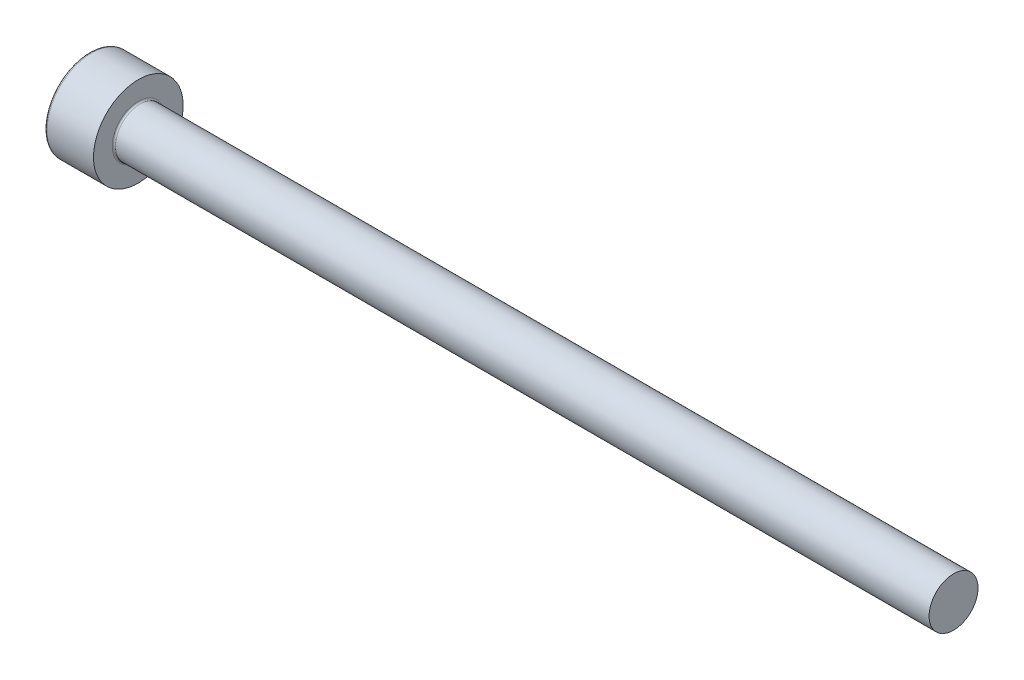
ISO-10303-21;
HEADER;
FILE_DESCRIPTION(('STEP AP214'),'2;1');
FILE_NAME('part.step','',(''),(''),'','','');
FILE_SCHEMA(('AUTOMOTIVE_DESIGN { 1 0 10303 214 1 1 1 1 }'));
ENDSEC;
DATA;
#1=APPLICATION_CONTEXT('core data for automotive mechanical design processes');
#2=APPLICATION_PROTOCOL_DEFINITION('international standard','automotive_design',2000,#1);
#3=PRODUCT_CONTEXT('',#1,'mechanical');
#4=PRODUCT('Part','Part','',(#3));
#5=PRODUCT_RELATED_PRODUCT_CATEGORY('part','',(#4));
#6=PRODUCT_DEFINITION_FORMATION('','',#4);
#7=PRODUCT_DEFINITION_CONTEXT('part definition',#1,'design');
#8=PRODUCT_DEFINITION('design','',#6,#7);
#9=PRODUCT_DEFINITION_SHAPE('','',#8);
#10=(LENGTH_UNIT() NAMED_UNIT(*) SI_UNIT(.MILLI.,.METRE.));
#11=(NAMED_UNIT(*) PLANE_ANGLE_UNIT() SI_UNIT($,.RADIAN.));
#12=(NAMED_UNIT(*) SI_UNIT($,.STERADIAN.) SOLID_ANGLE_UNIT());
#13=UNCERTAINTY_MEASURE_WITH_UNIT(LENGTH_MEASURE(1.E-05),#10,'distance_accuracy_value','');
#14=(GEOMETRIC_REPRESENTATION_CONTEXT(3) GLOBAL_UNCERTAINTY_ASSIGNED_CONTEXT((#13)) GLOBAL_UNIT_ASSIGNED_CONTEXT((#10,
#11,#12)) REPRESENTATION_CONTEXT('',''));
#15=CARTESIAN_POINT('',(0.,0.,0.));
#16=DIRECTION('',(0.,0.,1.));
#17=DIRECTION('',(1.,0.,0.));
#18=AXIS2_PLACEMENT_3D('',#15,#16,#17);
#19=CARTESIAN_POINT('',(-64.4045928047759,8.79516449896665,-40.4453986422559));
#20=DIRECTION('',(-1.,0.,0.));
#21=DIRECTION('',(0.,0.,1.));
#22=AXIS2_PLACEMENT_3D('',#19,#20,#21);
#23=CYLINDRICAL_SURFACE('',#22,1.49999999999999);
#24=CARTESIAN_POINT('',(-29.5545928047759,8.79516449896665,-40.4453986422559));
#25=DIRECTION('',(1.,0.,0.));
#26=DIRECTION('',(0.,0.,-1.));
#27=AXIS2_PLACEMENT_3D('',#24,#25,#26);
#28=CIRCLE('',#27,1.49999999999999);
#29=CARTESIAN_POINT('',(-29.5545928047759,8.79516449896665,-41.9453986422559));
#30=VERTEX_POINT('',#29);
#31=EDGE_CURVE('E156',#30,#30,#28,.T.);
#32=ORIENTED_EDGE('',*,*,#31,.T.);
#33=EDGE_LOOP('',(#32));
#34=FACE_BOUND('',#33,.T.);
#35=CARTESIAN_POINT('',(20.3454071952241,8.79516449896665,-40.4453986422559));
#36=DIRECTION('',(1.,0.,0.));
#37=DIRECTION('',(0.,0.,-1.));
#38=AXIS2_PLACEMENT_3D('',#35,#36,#37);
#39=CIRCLE('',#38,1.49999999999999);
#40=CARTESIAN_POINT('',(20.3454071952241,8.79516449896665,-41.9453986422559));
#41=VERTEX_POINT('',#40);
#42=EDGE_CURVE('E12',#41,#41,#39,.F.);
#43=ORIENTED_EDGE('',*,*,#42,.T.);
#44=EDGE_LOOP('',(#43));
#45=FACE_BOUND('',#44,.T.);
#46=ADVANCED_FACE('F42',(#34,#45),#23,.T.);
#47=CARTESIAN_POINT('',(-32.6545928047759,8.79516449896665,-40.4453986422559));
#48=DIRECTION('',(-1.,0.,0.));
#49=DIRECTION('',(0.,0.,1.));
#50=AXIS2_PLACEMENT_3D('',#47,#48,#49);
#51=PLANE('',#50);
#52=DIRECTION('',(0.,-0.499999999999998,0.866025403784439));
#53=VECTOR('',#52,1.);
#54=CARTESIAN_POINT('',(-32.6545928047759,10.2731811880921,-40.4453986422559));
#55=LINE('',#54,#53);
#56=CARTESIAN_POINT('',(-32.6545928047759,10.2731811880921,-40.4453986422559));
#57=VERTEX_POINT('',#56);
#58=CARTESIAN_POINT('',(-32.6545928047759,9.53417284352937,-39.1653986422559));
#59=VERTEX_POINT('',#58);
#60=EDGE_CURVE('E267',#57,#59,#55,.T.);
#61=ORIENTED_EDGE('',*,*,#60,.T.);
#62=DIRECTION('',(0.,1.,0.));
#63=VECTOR('',#62,1.);
#64=CARTESIAN_POINT('',(-32.6545928047759,8.05615615440393,-39.1653986422559));
#65=LINE('',#64,#63);
#66=CARTESIAN_POINT('',(-32.6545928047759,8.05615615440393,-39.1653986422559));
#67=VERTEX_POINT('',#66);
#68=EDGE_CURVE('E138',#67,#59,#65,.T.);
#69=ORIENTED_EDGE('',*,*,#68,.F.);
#70=DIRECTION('',(0.,-0.500000000000001,-0.866025403784438));
#71=VECTOR('',#70,1.);
#72=CARTESIAN_POINT('',(-32.6545928047759,8.05615615440393,-39.1653986422559));
#73=LINE('',#72,#71);
#74=CARTESIAN_POINT('',(-32.6545928047759,7.31714780984121,-40.4453986422559));
#75=VERTEX_POINT('',#74);
#76=EDGE_CURVE('E270',#67,#75,#73,.T.);
#77=ORIENTED_EDGE('',*,*,#76,.T.);
#78=DIRECTION('',(0.,0.499999999999998,-0.866025403784439));
#79=VECTOR('',#78,1.);
#80=CARTESIAN_POINT('',(-32.6545928047759,7.31714780984121,-40.4453986422559));
#81=LINE('',#80,#79);
#82=CARTESIAN_POINT('',(-32.6545928047759,8.05615615440393,-41.7253986422559));
#83=VERTEX_POINT('',#82);
#84=EDGE_CURVE('E273',#75,#83,#81,.T.);
#85=ORIENTED_EDGE('',*,*,#84,.T.);
#86=DIRECTION('',(0.,-1.,0.));
#87=VECTOR('',#86,1.);
#88=CARTESIAN_POINT('',(-32.6545928047759,9.53417284352937,-41.7253986422559));
#89=LINE('',#88,#87);
#90=CARTESIAN_POINT('',(-32.6545928047759,9.53417284352937,-41.7253986422559));
#91=VERTEX_POINT('',#90);
#92=EDGE_CURVE('E276',#91,#83,#89,.T.);
#93=ORIENTED_EDGE('',*,*,#92,.F.);
#94=DIRECTION('',(0.,-0.500000000000001,-0.866025403784438));
#95=VECTOR('',#94,1.);
#96=CARTESIAN_POINT('',(-32.6545928047759,10.2731811880921,-40.4453986422559));
#97=LINE('',#96,#95);
#98=EDGE_CURVE('E133',#57,#91,#97,.T.);
#99=ORIENTED_EDGE('',*,*,#98,.F.);
#100=EDGE_LOOP('',(#61,#69,#77,#85,#93,#99));
#101=FACE_BOUND('',#100,.T.);
#102=CARTESIAN_POINT('',(-32.6545928047759,8.79516449896665,-40.4453986422559));
#103=DIRECTION('',(-1.,0.,0.));
#104=DIRECTION('',(0.,0.,1.));
#105=AXIS2_PLACEMENT_3D('',#102,#103,#104);
#106=CIRCLE('',#105,2.6);
#107=CARTESIAN_POINT('',(-32.6545928047759,8.79516449896665,-37.8453986422559));
#108=VERTEX_POINT('',#107);
#109=EDGE_CURVE('E159',#108,#108,#106,.T.);
#110=ORIENTED_EDGE('',*,*,#109,.T.);
#111=EDGE_LOOP('',(#110));
#112=FACE_BOUND('',#111,.T.);
#113=ADVANCED_FACE('F173',(#101,#112),#51,.T.);
#114=CARTESIAN_POINT('',(-64.4045928047759,8.79516449896665,-40.4453986422559));
#115=DIRECTION('',(-1.,0.,0.));
#116=DIRECTION('',(0.,0.,1.));
#117=AXIS2_PLACEMENT_3D('',#114,#115,#116);
#118=CYLINDRICAL_SURFACE('',#117,2.75);
#119=CARTESIAN_POINT('',(-32.5045928047759,8.79516449896665,-40.4453986422559));
#120=DIRECTION('',(-1.,0.,0.));
#121=DIRECTION('',(0.,0.,1.));
#122=AXIS2_PLACEMENT_3D('',#119,#120,#121);
#123=CIRCLE('',#122,2.75);
#124=CARTESIAN_POINT('',(-32.5045928047759,8.79516449896665,-37.6953986422559));
#125=VERTEX_POINT('',#124);
#126=EDGE_CURVE('E50',#125,#125,#123,.F.);
#127=ORIENTED_EDGE('',*,*,#126,.T.);
#128=EDGE_LOOP('',(#127));
#129=FACE_BOUND('',#128,.T.);
#130=CARTESIAN_POINT('',(-29.6545928047759,8.79516449896665,-40.4453986422559));
#131=DIRECTION('',(-1.,0.,0.));
#132=DIRECTION('',(0.,0.,1.));
#133=AXIS2_PLACEMENT_3D('',#130,#131,#132);
#134=CIRCLE('',#133,2.75);
#135=CARTESIAN_POINT('',(-29.6545928047759,8.79516449896665,-37.6953986422559));
#136=VERTEX_POINT('',#135);
#137=EDGE_CURVE('E149',#136,#136,#134,.T.);
#138=ORIENTED_EDGE('',*,*,#137,.T.);
#139=EDGE_LOOP('',(#138));
#140=FACE_BOUND('',#139,.T.);
#141=ADVANCED_FACE('F164',(#129,#140),#118,.T.);
#142=CARTESIAN_POINT('',(-29.6545928047759,11.5451644989667,-40.4453986422559));
#143=DIRECTION('',(1.,0.,0.));
#144=DIRECTION('',(0.,0.,-1.));
#145=AXIS2_PLACEMENT_3D('',#142,#143,#144);
#146=PLANE('',#145);
#147=CARTESIAN_POINT('',(-29.6545928047759,8.79516449896665,-40.4453986422559));
#148=DIRECTION('',(1.,0.,0.));
#149=DIRECTION('',(0.,0.,-1.));
#150=AXIS2_PLACEMENT_3D('',#147,#148,#149);
#151=CIRCLE('',#150,1.59999999999999);
#152=CARTESIAN_POINT('',(-29.6545928047759,8.79516449896665,-42.0453986422559));
#153=VERTEX_POINT('',#152);
#154=EDGE_CURVE('E153',#153,#153,#151,.F.);
#155=ORIENTED_EDGE('',*,*,#154,.T.);
#156=EDGE_LOOP('',(#155));
#157=FACE_BOUND('',#156,.T.);
#158=ORIENTED_EDGE('',*,*,#137,.F.);
#159=EDGE_LOOP('',(#158));
#160=FACE_BOUND('',#159,.T.);
#161=ADVANCED_FACE('F181',(#157,#160),#146,.T.);
#162=CARTESIAN_POINT('',(20.3454071952241,10.0146644989667,-40.4453986422559));
#163=DIRECTION('',(1.,0.,0.));
#164=DIRECTION('',(0.,0.,-1.));
#165=AXIS2_PLACEMENT_3D('',#162,#163,#164);
#166=PLANE('',#165);
#167=ORIENTED_EDGE('',*,*,#42,.F.);
#168=EDGE_LOOP('',(#167));
#169=FACE_BOUND('',#168,.T.);
#170=ADVANCED_FACE('F44',(#169),#166,.T.);
#171=CARTESIAN_POINT('',(-29.5545928047759,8.79516449896665,-40.4453986422559));
#172=DIRECTION('',(1.,0.,0.));
#173=DIRECTION('',(0.,0.,-1.));
#174=AXIS2_PLACEMENT_3D('',#171,#172,#173);
#175=TOROIDAL_SURFACE('',#174,1.59999999999999,0.1);
#176=ORIENTED_EDGE('',*,*,#31,.F.);
#177=EDGE_LOOP('',(#176));
#178=FACE_BOUND('',#177,.T.);
#179=ORIENTED_EDGE('',*,*,#154,.F.);
#180=EDGE_LOOP('',(#179));
#181=FACE_BOUND('',#180,.T.);
#182=ADVANCED_FACE('F170',(#178,#181),#175,.F.);
#183=CARTESIAN_POINT('',(-32.5045928047759,8.79516449896665,-40.4453986422559));
#184=DIRECTION('',(-1.,0.,0.));
#185=DIRECTION('',(0.,0.,1.));
#186=AXIS2_PLACEMENT_3D('',#183,#184,#185);
#187=TOROIDAL_SURFACE('',#186,2.6,0.15);
#188=ORIENTED_EDGE('',*,*,#126,.F.);
#189=EDGE_LOOP('',(#188));
#190=FACE_BOUND('',#189,.T.);
#191=ORIENTED_EDGE('',*,*,#109,.F.);
#192=EDGE_LOOP('',(#191));
#193=FACE_BOUND('',#192,.T.);
#194=ADVANCED_FACE('F167',(#190,#193),#187,.T.);
#195=CARTESIAN_POINT('',(-31.3545928047759,10.2731811880921,-40.4453986422559));
#196=DIRECTION('',(0.,-0.86602540378444,-0.499999999999998));
#197=DIRECTION('',(0.,0.499999999999998,-0.86602540378444));
#198=AXIS2_PLACEMENT_3D('',#195,#196,#197);
#199=PLANE('',#198);
#200=ORIENTED_EDGE('',*,*,#60,.F.);
#201=DIRECTION('',(-1.,0.,0.));
#202=VECTOR('',#201,1.);
#203=CARTESIAN_POINT('',(-31.3545928047759,10.2731811880921,-40.4453986422559));
#204=LINE('',#203,#202);
#205=CARTESIAN_POINT('',(-31.3545928047759,10.2731811880921,-40.4453986422559));
#206=VERTEX_POINT('',#205);
#207=EDGE_CURVE('E257',#206,#57,#204,.T.);
#208=ORIENTED_EDGE('',*,*,#207,.F.);
#209=DIRECTION('',(0.,-0.499999999999998,0.866025403784439));
#210=VECTOR('',#209,1.);
#211=CARTESIAN_POINT('',(-31.3545928047759,10.2731811880921,-40.4453986422559));
#212=LINE('',#211,#210);
#213=CARTESIAN_POINT('',(-31.3545928047759,9.90367701581073,-39.8053986422559));
#214=VERTEX_POINT('',#213);
#215=EDGE_CURVE('E125',#206,#214,#212,.T.);
#216=ORIENTED_EDGE('',*,*,#215,.T.);
#217=CARTESIAN_POINT('',(-31.3545928047759,9.53417284352937,-39.1653986422559));
#218=VERTEX_POINT('',#217);
#219=EDGE_CURVE('E116',#214,#218,#212,.T.);
#220=ORIENTED_EDGE('',*,*,#219,.T.);
#221=DIRECTION('',(-1.,0.,0.));
#222=VECTOR('',#221,1.);
#223=CARTESIAN_POINT('',(-31.3545928047759,9.53417284352937,-39.1653986422559));
#224=LINE('',#223,#222);
#225=EDGE_CURVE('E130',#218,#59,#224,.T.);
#226=ORIENTED_EDGE('',*,*,#225,.T.);
#227=EDGE_LOOP('',(#200,#208,#216,#220,#226));
#228=FACE_BOUND('',#227,.T.);
#229=ADVANCED_FACE('F129',(#228),#199,.T.);
#230=CARTESIAN_POINT('',(-31.3545928047759,8.05615615440393,-39.1653986422559));
#231=DIRECTION('',(0.,0.,1.));
#232=DIRECTION('',(0.,-1.,0.));
#233=AXIS2_PLACEMENT_3D('',#230,#231,#232);
#234=PLANE('',#233);
#235=ORIENTED_EDGE('',*,*,#68,.T.);
#236=ORIENTED_EDGE('',*,*,#225,.F.);
#237=DIRECTION('',(0.,1.,0.));
#238=VECTOR('',#237,1.);
#239=CARTESIAN_POINT('',(-31.3545928047759,8.05615615440393,-39.1653986422559));
#240=LINE('',#239,#238);
#241=CARTESIAN_POINT('',(-31.3545928047759,8.79516449896665,-39.1653986422559));
#242=VERTEX_POINT('',#241);
#243=EDGE_CURVE('E113',#242,#218,#240,.T.);
#244=ORIENTED_EDGE('',*,*,#243,.F.);
#245=CARTESIAN_POINT('',(-31.3545928047759,8.05615615440393,-39.1653986422559));
#246=VERTEX_POINT('',#245);
#247=EDGE_CURVE('E124',#246,#242,#240,.T.);
#248=ORIENTED_EDGE('',*,*,#247,.F.);
#249=DIRECTION('',(-1.,0.,0.));
#250=VECTOR('',#249,1.);
#251=CARTESIAN_POINT('',(-31.3545928047759,8.05615615440393,-39.1653986422559));
#252=LINE('',#251,#250);
#253=EDGE_CURVE('E140',#246,#67,#252,.T.);
#254=ORIENTED_EDGE('',*,*,#253,.T.);
#255=EDGE_LOOP('',(#235,#236,#244,#248,#254));
#256=FACE_BOUND('',#255,.T.);
#257=ADVANCED_FACE('F135',(#256),#234,.F.);
#258=CARTESIAN_POINT('',(-31.3545928047759,8.05615615440393,-39.1653986422559));
#259=DIRECTION('',(0.,0.866025403784438,-0.500000000000001));
#260=DIRECTION('',(0.,0.500000000000001,0.866025403784438));
#261=AXIS2_PLACEMENT_3D('',#258,#259,#260);
#262=PLANE('',#261);
#263=ORIENTED_EDGE('',*,*,#76,.F.);
#264=ORIENTED_EDGE('',*,*,#253,.F.);
#265=DIRECTION('',(0.,-0.500000000000001,-0.866025403784438));
#266=VECTOR('',#265,1.);
#267=CARTESIAN_POINT('',(-31.3545928047759,8.05615615440393,-39.1653986422559));
#268=LINE('',#267,#266);
#269=CARTESIAN_POINT('',(-31.3545928047759,7.68665198212257,-39.8053986422559));
#270=VERTEX_POINT('',#269);
#271=EDGE_CURVE('E296',#246,#270,#268,.T.);
#272=ORIENTED_EDGE('',*,*,#271,.T.);
#273=CARTESIAN_POINT('',(-31.3545928047759,7.31714780984121,-40.4453986422559));
#274=VERTEX_POINT('',#273);
#275=EDGE_CURVE('E285',#270,#274,#268,.T.);
#276=ORIENTED_EDGE('',*,*,#275,.T.);
#277=DIRECTION('',(-1.,0.,0.));
#278=VECTOR('',#277,1.);
#279=CARTESIAN_POINT('',(-31.3545928047759,7.31714780984121,-40.4453986422559));
#280=LINE('',#279,#278);
#281=EDGE_CURVE('E145',#274,#75,#280,.T.);
#282=ORIENTED_EDGE('',*,*,#281,.T.);
#283=EDGE_LOOP('',(#263,#264,#272,#276,#282));
#284=FACE_BOUND('',#283,.T.);
#285=ADVANCED_FACE('F211',(#284),#262,.T.);
#286=CARTESIAN_POINT('',(-31.3545928047759,7.31714780984121,-40.4453986422559));
#287=DIRECTION('',(0.,0.86602540378444,0.499999999999998));
#288=DIRECTION('',(0.,-0.499999999999998,0.86602540378444));
#289=AXIS2_PLACEMENT_3D('',#286,#287,#288);
#290=PLANE('',#289);
#291=ORIENTED_EDGE('',*,*,#84,.F.);
#292=ORIENTED_EDGE('',*,*,#281,.F.);
#293=DIRECTION('',(0.,0.499999999999998,-0.866025403784439));
#294=VECTOR('',#293,1.);
#295=CARTESIAN_POINT('',(-31.3545928047759,7.31714780984121,-40.4453986422559));
#296=LINE('',#295,#294);
#297=CARTESIAN_POINT('',(-31.3545928047759,7.68665198212257,-41.0853986422559));
#298=VERTEX_POINT('',#297);
#299=EDGE_CURVE('E263',#274,#298,#296,.T.);
#300=ORIENTED_EDGE('',*,*,#299,.T.);
#301=CARTESIAN_POINT('',(-31.3545928047759,8.05615615440393,-41.7253986422559));
#302=VERTEX_POINT('',#301);
#303=EDGE_CURVE('E295',#298,#302,#296,.T.);
#304=ORIENTED_EDGE('',*,*,#303,.T.);
#305=DIRECTION('',(-1.,0.,0.));
#306=VECTOR('',#305,1.);
#307=CARTESIAN_POINT('',(-31.3545928047759,8.05615615440393,-41.7253986422559));
#308=LINE('',#307,#306);
#309=EDGE_CURVE('E256',#302,#83,#308,.T.);
#310=ORIENTED_EDGE('',*,*,#309,.T.);
#311=EDGE_LOOP('',(#291,#292,#300,#304,#310));
#312=FACE_BOUND('',#311,.T.);
#313=ADVANCED_FACE('F214',(#312),#290,.T.);
#314=CARTESIAN_POINT('',(-31.3545928047759,9.53417284352937,-41.7253986422559));
#315=DIRECTION('',(0.,0.,-1.));
#316=DIRECTION('',(0.,1.,0.));
#317=AXIS2_PLACEMENT_3D('',#314,#315,#316);
#318=PLANE('',#317);
#319=ORIENTED_EDGE('',*,*,#92,.T.);
#320=ORIENTED_EDGE('',*,*,#309,.F.);
#321=DIRECTION('',(0.,-1.,0.));
#322=VECTOR('',#321,1.);
#323=CARTESIAN_POINT('',(-31.3545928047759,9.53417284352937,-41.7253986422559));
#324=LINE('',#323,#322);
#325=CARTESIAN_POINT('',(-31.3545928047759,8.79516449896665,-41.7253986422559));
#326=VERTEX_POINT('',#325);
#327=EDGE_CURVE('E260',#326,#302,#324,.T.);
#328=ORIENTED_EDGE('',*,*,#327,.F.);
#329=CARTESIAN_POINT('',(-31.3545928047759,9.53417284352937,-41.7253986422559));
#330=VERTEX_POINT('',#329);
#331=EDGE_CURVE('E57',#330,#326,#324,.T.);
#332=ORIENTED_EDGE('',*,*,#331,.F.);
#333=DIRECTION('',(-1.,0.,0.));
#334=VECTOR('',#333,1.);
#335=CARTESIAN_POINT('',(-31.3545928047759,9.53417284352937,-41.7253986422559));
#336=LINE('',#335,#334);
#337=EDGE_CURVE('E253',#330,#91,#336,.T.);
#338=ORIENTED_EDGE('',*,*,#337,.T.);
#339=EDGE_LOOP('',(#319,#320,#328,#332,#338));
#340=FACE_BOUND('',#339,.T.);
#341=ADVANCED_FACE('F218',(#340),#318,.F.);
#342=CARTESIAN_POINT('',(-31.3545928047759,10.2731811880921,-40.4453986422559));
#343=DIRECTION('',(0.,0.866025403784438,-0.500000000000001));
#344=DIRECTION('',(0.,0.500000000000001,0.866025403784438));
#345=AXIS2_PLACEMENT_3D('',#342,#343,#344);
#346=PLANE('',#345);
#347=ORIENTED_EDGE('',*,*,#98,.T.);
#348=ORIENTED_EDGE('',*,*,#337,.F.);
#349=DIRECTION('',(0.,-0.500000000000001,-0.866025403784438));
#350=VECTOR('',#349,1.);
#351=CARTESIAN_POINT('',(-31.3545928047759,10.2731811880921,-40.4453986422559));
#352=LINE('',#351,#350);
#353=CARTESIAN_POINT('',(-31.3545928047759,9.90367701581073,-41.0853986422559));
#354=VERTEX_POINT('',#353);
#355=EDGE_CURVE('E243',#354,#330,#352,.T.);
#356=ORIENTED_EDGE('',*,*,#355,.F.);
#357=EDGE_CURVE('E249',#206,#354,#352,.T.);
#358=ORIENTED_EDGE('',*,*,#357,.F.);
#359=ORIENTED_EDGE('',*,*,#207,.T.);
#360=EDGE_LOOP('',(#347,#348,#356,#358,#359));
#361=FACE_BOUND('',#360,.T.);
#362=ADVANCED_FACE('F222',(#361),#346,.F.);
#363=CARTESIAN_POINT('',(-31.3545928047759,11.0121895326548,-41.7253986422559));
#364=DIRECTION('',(1.,0.,0.));
#365=DIRECTION('',(0.,0.,-1.));
#366=AXIS2_PLACEMENT_3D('',#363,#364,#365);
#367=PLANE('',#366);
#368=ORIENTED_EDGE('',*,*,#327,.T.);
#369=ORIENTED_EDGE('',*,*,#303,.F.);
#370=CARTESIAN_POINT('',(-31.3545928047759,8.79516449896665,-40.4453986422559));
#371=DIRECTION('',(-1.,0.,0.));
#372=DIRECTION('',(0.,0.,1.));
#373=AXIS2_PLACEMENT_3D('',#370,#371,#372);
#374=CIRCLE('',#373,1.28);
#375=EDGE_CURVE('E291',#326,#298,#374,.T.);
#376=ORIENTED_EDGE('',*,*,#375,.F.);
#377=EDGE_LOOP('',(#368,#369,#376));
#378=FACE_BOUND('',#377,.T.);
#379=ADVANCED_FACE('F226',(#378),#367,.F.);
#380=ORIENTED_EDGE('',*,*,#299,.F.);
#381=ORIENTED_EDGE('',*,*,#275,.F.);
#382=EDGE_CURVE('E143',#298,#270,#374,.T.);
#383=ORIENTED_EDGE('',*,*,#382,.F.);
#384=EDGE_LOOP('',(#380,#381,#383));
#385=FACE_BOUND('',#384,.T.);
#386=ADVANCED_FACE('F229',(#385),#367,.F.);
#387=ORIENTED_EDGE('',*,*,#271,.F.);
#388=ORIENTED_EDGE('',*,*,#247,.T.);
#389=EDGE_CURVE('E139',#270,#242,#374,.T.);
#390=ORIENTED_EDGE('',*,*,#389,.F.);
#391=EDGE_LOOP('',(#387,#388,#390));
#392=FACE_BOUND('',#391,.T.);
#393=ADVANCED_FACE('F234',(#392),#367,.F.);
#394=ORIENTED_EDGE('',*,*,#243,.T.);
#395=ORIENTED_EDGE('',*,*,#219,.F.);
#396=EDGE_CURVE('E119',#242,#214,#374,.T.);
#397=ORIENTED_EDGE('',*,*,#396,.F.);
#398=EDGE_LOOP('',(#394,#395,#397));
#399=FACE_BOUND('',#398,.T.);
#400=ADVANCED_FACE('F115',(#399),#367,.F.);
#401=ORIENTED_EDGE('',*,*,#215,.F.);
#402=ORIENTED_EDGE('',*,*,#357,.T.);
#403=EDGE_CURVE('E150',#214,#354,#374,.T.);
#404=ORIENTED_EDGE('',*,*,#403,.F.);
#405=EDGE_LOOP('',(#401,#402,#404));
#406=FACE_BOUND('',#405,.T.);
#407=ADVANCED_FACE('F237',(#406),#367,.F.);
#408=ORIENTED_EDGE('',*,*,#355,.T.);
#409=ORIENTED_EDGE('',*,*,#331,.T.);
#410=EDGE_CURVE('E246',#354,#326,#374,.T.);
#411=ORIENTED_EDGE('',*,*,#410,.F.);
#412=EDGE_LOOP('',(#408,#409,#411));
#413=FACE_BOUND('',#412,.T.);
#414=ADVANCED_FACE('F206',(#413),#367,.F.);
#415=CARTESIAN_POINT('',(-31.3545928047759,8.79516449896665,-40.4453986422559));
#416=DIRECTION('',(-1.,0.,0.));
#417=DIRECTION('',(0.,0.,1.));
#418=AXIS2_PLACEMENT_3D('',#415,#416,#417);
#419=CONICAL_SURFACE('',#418,1.28,1.04719755119659);
#420=CARTESIAN_POINT('',(-30.6155844602132,8.79516449896665,-40.4453986422559));
#421=VERTEX_POINT('',#420);
#422=VERTEX_LOOP('',#421);
#423=FACE_BOUND('',#422,.T.);
#424=ORIENTED_EDGE('',*,*,#396,.T.);
#425=ORIENTED_EDGE('',*,*,#403,.T.);
#426=ORIENTED_EDGE('',*,*,#410,.T.);
#427=ORIENTED_EDGE('',*,*,#375,.T.);
#428=ORIENTED_EDGE('',*,*,#382,.T.);
#429=ORIENTED_EDGE('',*,*,#389,.T.);
#430=EDGE_LOOP('',(#424,#425,#426,#427,#428,#429));
#431=FACE_BOUND('',#430,.T.);
#432=ADVANCED_FACE('F203',(#423,#431),#419,.F.);
#433=CLOSED_SHELL('',(#46,#113,#141,#161,#170,#182,#194,#229,#257,#285,#313,#341,#362,#379,#386,
#393,#400,#407,#414,#432));
#434=MANIFOLD_SOLID_BREP('B2',#433);
#435=ADVANCED_BREP_SHAPE_REPRESENTATION('',(#18,#434),#14);
#436=SHAPE_DEFINITION_REPRESENTATION(#9,#435);
ENDSEC;
END-ISO-10303-21;
